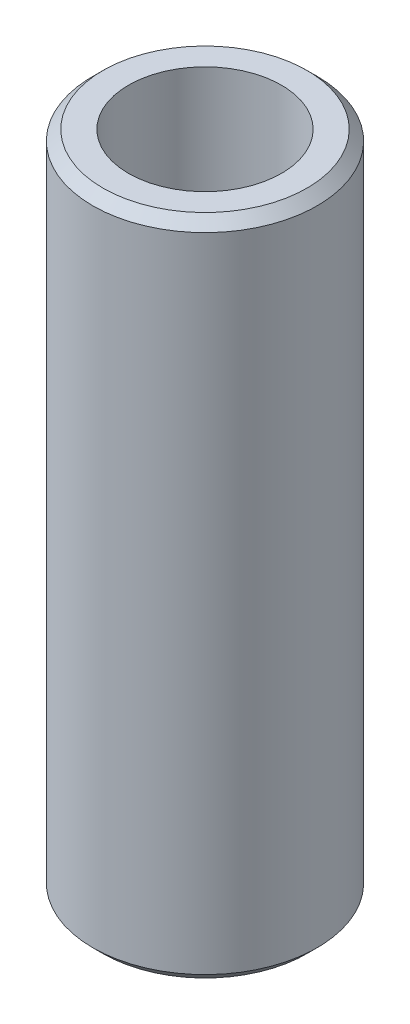
ISO-10303-21;
HEADER;
FILE_DESCRIPTION(('STEP AP214'),'2;1');
FILE_NAME('part.step','',(''),(''),'','','');
FILE_SCHEMA(('AUTOMOTIVE_DESIGN { 1 0 10303 214 1 1 1 1 }'));
ENDSEC;
DATA;
#1=APPLICATION_CONTEXT('core data for automotive mechanical design processes');
#2=APPLICATION_PROTOCOL_DEFINITION('international standard','automotive_design',2000,#1);
#3=PRODUCT_CONTEXT('',#1,'mechanical');
#4=PRODUCT('Part','Part','',(#3));
#5=PRODUCT_RELATED_PRODUCT_CATEGORY('part','',(#4));
#6=PRODUCT_DEFINITION_FORMATION('','',#4);
#7=PRODUCT_DEFINITION_CONTEXT('part definition',#1,'design');
#8=PRODUCT_DEFINITION('design','',#6,#7);
#9=PRODUCT_DEFINITION_SHAPE('','',#8);
#10=(LENGTH_UNIT() NAMED_UNIT(*) SI_UNIT(.MILLI.,.METRE.));
#11=(NAMED_UNIT(*) PLANE_ANGLE_UNIT() SI_UNIT($,.RADIAN.));
#12=(NAMED_UNIT(*) SI_UNIT($,.STERADIAN.) SOLID_ANGLE_UNIT());
#13=UNCERTAINTY_MEASURE_WITH_UNIT(LENGTH_MEASURE(1.E-05),#10,'distance_accuracy_value','');
#14=(GEOMETRIC_REPRESENTATION_CONTEXT(3) GLOBAL_UNCERTAINTY_ASSIGNED_CONTEXT((#13)) GLOBAL_UNIT_ASSIGNED_CONTEXT((#10,
#11,#12)) REPRESENTATION_CONTEXT('',''));
#15=CARTESIAN_POINT('',(0.,0.,0.));
#16=DIRECTION('',(0.,0.,1.));
#17=DIRECTION('',(1.,0.,0.));
#18=AXIS2_PLACEMENT_3D('',#15,#16,#17);
#19=CARTESIAN_POINT('',(0.,-130.,0.));
#20=DIRECTION('',(0.,1.,0.));
#21=DIRECTION('',(0.,0.,1.));
#22=AXIS2_PLACEMENT_3D('',#19,#20,#21);
#23=CYLINDRICAL_SURFACE('',#22,22.);
#24=CARTESIAN_POINT('',(0.,-128.,0.));
#25=DIRECTION('',(0.,1.,0.));
#26=DIRECTION('',(0.,0.,1.));
#27=AXIS2_PLACEMENT_3D('',#24,#25,#26);
#28=CIRCLE('',#27,22.);
#29=CARTESIAN_POINT('',(0.,-128.,22.));
#30=VERTEX_POINT('',#29);
#31=EDGE_CURVE('E53',#30,#30,#28,.T.);
#32=ORIENTED_EDGE('',*,*,#31,.T.);
#33=EDGE_LOOP('',(#32));
#34=FACE_BOUND('',#33,.T.);
#35=CARTESIAN_POINT('',(0.,-2.00000000000003,0.));
#36=DIRECTION('',(0.,1.,0.));
#37=DIRECTION('',(0.,0.,1.));
#38=AXIS2_PLACEMENT_3D('',#35,#36,#37);
#39=CIRCLE('',#38,22.);
#40=CARTESIAN_POINT('',(0.,-2.00000000000003,22.));
#41=VERTEX_POINT('',#40);
#42=EDGE_CURVE('E57',#41,#41,#39,.F.);
#43=ORIENTED_EDGE('',*,*,#42,.T.);
#44=EDGE_LOOP('',(#43));
#45=FACE_BOUND('',#44,.T.);
#46=ADVANCED_FACE('F41',(#34,#45),#23,.T.);
#47=CARTESIAN_POINT('',(0.,-130.,0.));
#48=DIRECTION('',(0.,1.,0.));
#49=DIRECTION('',(0.,0.,1.));
#50=AXIS2_PLACEMENT_3D('',#47,#48,#49);
#51=PLANE('',#50);
#52=CARTESIAN_POINT('',(0.,-130.,0.));
#53=DIRECTION('',(0.,1.,0.));
#54=DIRECTION('',(0.,0.,1.));
#55=AXIS2_PLACEMENT_3D('',#52,#53,#54);
#56=CIRCLE('',#55,20.);
#57=CARTESIAN_POINT('',(0.,-130.,20.));
#58=VERTEX_POINT('',#57);
#59=EDGE_CURVE('E49',#58,#58,#56,.F.);
#60=ORIENTED_EDGE('',*,*,#59,.T.);
#61=EDGE_LOOP('',(#60));
#62=FACE_BOUND('',#61,.T.);
#63=CARTESIAN_POINT('',(0.,-130.,0.));
#64=DIRECTION('',(0.,1.,0.));
#65=DIRECTION('',(0.,0.,1.));
#66=AXIS2_PLACEMENT_3D('',#63,#64,#65);
#67=CIRCLE('',#66,15.);
#68=CARTESIAN_POINT('',(0.,-130.,15.));
#69=VERTEX_POINT('',#68);
#70=EDGE_CURVE('E62',#69,#69,#67,.T.);
#71=ORIENTED_EDGE('',*,*,#70,.T.);
#72=EDGE_LOOP('',(#71));
#73=FACE_BOUND('',#72,.T.);
#74=ADVANCED_FACE('F69',(#62,#73),#51,.F.);
#75=CARTESIAN_POINT('',(0.,0.,0.));
#76=DIRECTION('',(0.,1.,0.));
#77=DIRECTION('',(0.,0.,1.));
#78=AXIS2_PLACEMENT_3D('',#75,#76,#77);
#79=PLANE('',#78);
#80=CARTESIAN_POINT('',(0.,0.,0.));
#81=DIRECTION('',(0.,1.,0.));
#82=DIRECTION('',(0.,0.,1.));
#83=AXIS2_PLACEMENT_3D('',#80,#81,#82);
#84=CIRCLE('',#83,20.);
#85=CARTESIAN_POINT('',(0.,0.,20.));
#86=VERTEX_POINT('',#85);
#87=EDGE_CURVE('E10',#86,#86,#84,.T.);
#88=ORIENTED_EDGE('',*,*,#87,.T.);
#89=EDGE_LOOP('',(#88));
#90=FACE_BOUND('',#89,.T.);
#91=CARTESIAN_POINT('',(0.,0.,0.));
#92=DIRECTION('',(0.,1.,0.));
#93=DIRECTION('',(0.,0.,1.));
#94=AXIS2_PLACEMENT_3D('',#91,#92,#93);
#95=CIRCLE('',#94,15.);
#96=CARTESIAN_POINT('',(0.,0.,15.));
#97=VERTEX_POINT('',#96);
#98=EDGE_CURVE('E63',#97,#97,#95,.T.);
#99=ORIENTED_EDGE('',*,*,#98,.F.);
#100=EDGE_LOOP('',(#99));
#101=FACE_BOUND('',#100,.T.);
#102=ADVANCED_FACE('F75',(#90,#101),#79,.T.);
#103=CARTESIAN_POINT('',(0.,-130.,0.));
#104=DIRECTION('',(0.,1.,0.));
#105=DIRECTION('',(0.,0.,1.));
#106=AXIS2_PLACEMENT_3D('',#103,#104,#105);
#107=CYLINDRICAL_SURFACE('',#106,15.);
#108=ORIENTED_EDGE('',*,*,#70,.F.);
#109=EDGE_LOOP('',(#108));
#110=FACE_BOUND('',#109,.T.);
#111=ORIENTED_EDGE('',*,*,#98,.T.);
#112=EDGE_LOOP('',(#111));
#113=FACE_BOUND('',#112,.T.);
#114=ADVANCED_FACE('F71',(#110,#113),#107,.F.);
#115=CARTESIAN_POINT('',(0.,-128.,0.));
#116=DIRECTION('',(0.,1.,0.));
#117=DIRECTION('',(0.,0.,1.));
#118=AXIS2_PLACEMENT_3D('',#115,#116,#117);
#119=CONICAL_SURFACE('',#118,22.,0.785398163397447);
#120=ORIENTED_EDGE('',*,*,#59,.F.);
#121=EDGE_LOOP('',(#120));
#122=FACE_BOUND('',#121,.T.);
#123=ORIENTED_EDGE('',*,*,#31,.F.);
#124=EDGE_LOOP('',(#123));
#125=FACE_BOUND('',#124,.T.);
#126=ADVANCED_FACE('F74',(#122,#125),#119,.T.);
#127=CARTESIAN_POINT('',(0.,0.,0.));
#128=DIRECTION('',(0.,-1.,0.));
#129=DIRECTION('',(0.,0.,-1.));
#130=AXIS2_PLACEMENT_3D('',#127,#128,#129);
#131=CONICAL_SURFACE('',#130,20.,0.78539816339745);
#132=ORIENTED_EDGE('',*,*,#42,.F.);
#133=EDGE_LOOP('',(#132));
#134=FACE_BOUND('',#133,.T.);
#135=ORIENTED_EDGE('',*,*,#87,.F.);
#136=EDGE_LOOP('',(#135));
#137=FACE_BOUND('',#136,.T.);
#138=ADVANCED_FACE('F44',(#134,#137),#131,.T.);
#139=CLOSED_SHELL('',(#46,#74,#102,#114,#126,#138));
#140=MANIFOLD_SOLID_BREP('B2',#139);
#141=ADVANCED_BREP_SHAPE_REPRESENTATION('',(#18,#140),#14);
#142=SHAPE_DEFINITION_REPRESENTATION(#9,#141);
ENDSEC;
END-ISO-10303-21;
